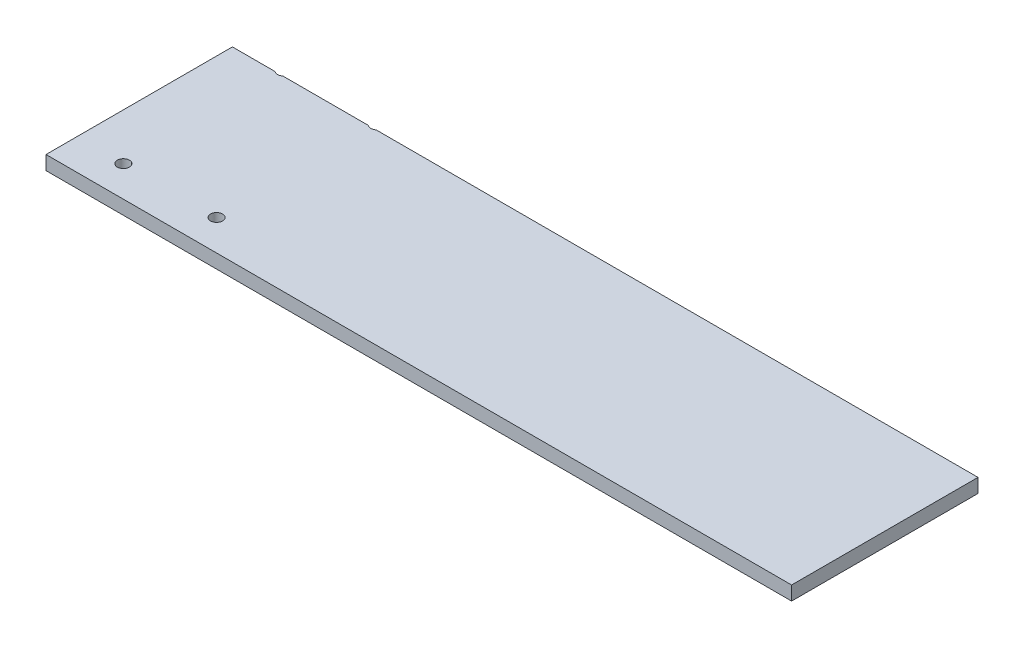
ISO-10303-21;
HEADER;
FILE_DESCRIPTION(('STEP AP214'),'2;1');
FILE_NAME('part.step','',(''),(''),'','','');
FILE_SCHEMA(('AUTOMOTIVE_DESIGN { 1 0 10303 214 1 1 1 1 }'));
ENDSEC;
DATA;
#1=APPLICATION_CONTEXT('core data for automotive mechanical design processes');
#2=APPLICATION_PROTOCOL_DEFINITION('international standard','automotive_design',2000,#1);
#3=PRODUCT_CONTEXT('',#1,'mechanical');
#4=PRODUCT('Part','Part','',(#3));
#5=PRODUCT_RELATED_PRODUCT_CATEGORY('part','',(#4));
#6=PRODUCT_DEFINITION_FORMATION('','',#4);
#7=PRODUCT_DEFINITION_CONTEXT('part definition',#1,'design');
#8=PRODUCT_DEFINITION('design','',#6,#7);
#9=PRODUCT_DEFINITION_SHAPE('','',#8);
#10=(LENGTH_UNIT() NAMED_UNIT(*) SI_UNIT(.MILLI.,.METRE.));
#11=(NAMED_UNIT(*) PLANE_ANGLE_UNIT() SI_UNIT($,.RADIAN.));
#12=(NAMED_UNIT(*) SI_UNIT($,.STERADIAN.) SOLID_ANGLE_UNIT());
#13=UNCERTAINTY_MEASURE_WITH_UNIT(LENGTH_MEASURE(1.E-05),#10,'distance_accuracy_value','');
#14=(GEOMETRIC_REPRESENTATION_CONTEXT(3) GLOBAL_UNCERTAINTY_ASSIGNED_CONTEXT((#13)) GLOBAL_UNIT_ASSIGNED_CONTEXT((#10,
#11,#12)) REPRESENTATION_CONTEXT('',''));
#15=CARTESIAN_POINT('',(0.,0.,0.));
#16=DIRECTION('',(0.,0.,1.));
#17=DIRECTION('',(1.,0.,0.));
#18=AXIS2_PLACEMENT_3D('',#15,#16,#17);
#19=CARTESIAN_POINT('',(-400.,7.5,-100.));
#20=DIRECTION('',(0.,0.,1.));
#21=DIRECTION('',(1.,0.,0.));
#22=AXIS2_PLACEMENT_3D('',#19,#20,#21);
#23=PLANE('',#22);
#24=DIRECTION('',(-1.,0.,0.));
#25=VECTOR('',#24,1.);
#26=CARTESIAN_POINT('',(-400.,-7.5,-100.));
#27=LINE('',#26,#25);
#28=CARTESIAN_POINT('',(-254.153311931459,-7.5,-100.));
#29=VERTEX_POINT('',#28);
#30=CARTESIAN_POINT('',(-345.846688068541,-7.5,-100.));
#31=VERTEX_POINT('',#30);
#32=EDGE_CURVE('E105',#29,#31,#27,.T.);
#33=ORIENTED_EDGE('',*,*,#32,.T.);
#34=DIRECTION('',(0.,1.,0.));
#35=VECTOR('',#34,1.);
#36=CARTESIAN_POINT('',(-345.846688068541,-7.5,-100.));
#37=LINE('',#36,#35);
#38=CARTESIAN_POINT('',(-345.846688068541,7.5,-100.));
#39=VERTEX_POINT('',#38);
#40=EDGE_CURVE('E47',#31,#39,#37,.T.);
#41=ORIENTED_EDGE('',*,*,#40,.T.);
#42=DIRECTION('',(-1.,0.,0.));
#43=VECTOR('',#42,1.);
#44=CARTESIAN_POINT('',(-400.,7.5,-100.));
#45=LINE('',#44,#43);
#46=CARTESIAN_POINT('',(-254.153311931459,7.5,-100.));
#47=VERTEX_POINT('',#46);
#48=EDGE_CURVE('E107',#47,#39,#45,.T.);
#49=ORIENTED_EDGE('',*,*,#48,.F.);
#50=DIRECTION('',(0.,1.,0.));
#51=VECTOR('',#50,1.);
#52=CARTESIAN_POINT('',(-254.153311931459,-7.5,-100.));
#53=LINE('',#52,#51);
#54=EDGE_CURVE('E96',#47,#29,#53,.F.);
#55=ORIENTED_EDGE('',*,*,#54,.T.);
#56=EDGE_LOOP('',(#33,#41,#49,#55));
#57=FACE_BOUND('',#56,.T.);
#58=ADVANCED_FACE('F33',(#57),#23,.F.);
#59=CARTESIAN_POINT('',(400.,-7.5,-100.));
#60=VERTEX_POINT('',#59);
#61=CARTESIAN_POINT('',(-245.846688068541,-7.5,-100.));
#62=VERTEX_POINT('',#61);
#63=EDGE_CURVE('E113',#60,#62,#27,.T.);
#64=ORIENTED_EDGE('',*,*,#63,.T.);
#65=DIRECTION('',(0.,1.,0.));
#66=VECTOR('',#65,1.);
#67=CARTESIAN_POINT('',(-245.846688068541,-7.5,-100.));
#68=LINE('',#67,#66);
#69=CARTESIAN_POINT('',(-245.846688068541,7.5,-100.));
#70=VERTEX_POINT('',#69);
#71=EDGE_CURVE('E55',#62,#70,#68,.T.);
#72=ORIENTED_EDGE('',*,*,#71,.T.);
#73=CARTESIAN_POINT('',(400.,7.5,-100.));
#74=VERTEX_POINT('',#73);
#75=EDGE_CURVE('E141',#74,#70,#45,.T.);
#76=ORIENTED_EDGE('',*,*,#75,.F.);
#77=DIRECTION('',(0.,-1.,0.));
#78=VECTOR('',#77,1.);
#79=CARTESIAN_POINT('',(400.,7.5,-100.));
#80=LINE('',#79,#78);
#81=EDGE_CURVE('E101',#74,#60,#80,.T.);
#82=ORIENTED_EDGE('',*,*,#81,.T.);
#83=EDGE_LOOP('',(#64,#72,#76,#82));
#84=FACE_BOUND('',#83,.T.);
#85=ADVANCED_FACE('F139',(#84),#23,.F.);
#86=CARTESIAN_POINT('',(400.,7.5,100.));
#87=DIRECTION('',(-1.,0.,0.));
#88=DIRECTION('',(0.,0.,1.));
#89=AXIS2_PLACEMENT_3D('',#86,#87,#88);
#90=PLANE('',#89);
#91=DIRECTION('',(0.,0.,-1.));
#92=VECTOR('',#91,1.);
#93=CARTESIAN_POINT('',(400.,-7.5,100.));
#94=LINE('',#93,#92);
#95=CARTESIAN_POINT('',(400.,-7.5,100.));
#96=VERTEX_POINT('',#95);
#97=EDGE_CURVE('E117',#96,#60,#94,.T.);
#98=ORIENTED_EDGE('',*,*,#97,.T.);
#99=ORIENTED_EDGE('',*,*,#81,.F.);
#100=DIRECTION('',(0.,0.,-1.));
#101=VECTOR('',#100,1.);
#102=CARTESIAN_POINT('',(400.,7.5,100.));
#103=LINE('',#102,#101);
#104=CARTESIAN_POINT('',(400.,7.5,100.));
#105=VERTEX_POINT('',#104);
#106=EDGE_CURVE('E124',#105,#74,#103,.T.);
#107=ORIENTED_EDGE('',*,*,#106,.F.);
#108=DIRECTION('',(0.,-1.,0.));
#109=VECTOR('',#108,1.);
#110=CARTESIAN_POINT('',(400.,7.5,100.));
#111=LINE('',#110,#109);
#112=EDGE_CURVE('E125',#105,#96,#111,.T.);
#113=ORIENTED_EDGE('',*,*,#112,.T.);
#114=EDGE_LOOP('',(#98,#99,#107,#113));
#115=FACE_BOUND('',#114,.T.);
#116=ADVANCED_FACE('F35',(#115),#90,.F.);
#117=CARTESIAN_POINT('',(-354.153311931459,7.5,-100.));
#118=VERTEX_POINT('',#117);
#119=CARTESIAN_POINT('',(-400.,7.5,-100.));
#120=VERTEX_POINT('',#119);
#121=EDGE_CURVE('E155',#118,#120,#45,.T.);
#122=ORIENTED_EDGE('',*,*,#121,.F.);
#123=DIRECTION('',(0.,1.,0.));
#124=VECTOR('',#123,1.);
#125=CARTESIAN_POINT('',(-354.153311931459,-7.5,-100.));
#126=LINE('',#125,#124);
#127=CARTESIAN_POINT('',(-354.153311931459,-7.5,-100.));
#128=VERTEX_POINT('',#127);
#129=EDGE_CURVE('E148',#118,#128,#126,.F.);
#130=ORIENTED_EDGE('',*,*,#129,.T.);
#131=CARTESIAN_POINT('',(-400.,-7.5,-100.));
#132=VERTEX_POINT('',#131);
#133=EDGE_CURVE('E114',#128,#132,#27,.T.);
#134=ORIENTED_EDGE('',*,*,#133,.T.);
#135=DIRECTION('',(0.,-1.,0.));
#136=VECTOR('',#135,1.);
#137=CARTESIAN_POINT('',(-400.,7.5,-100.));
#138=LINE('',#137,#136);
#139=EDGE_CURVE('E132',#120,#132,#138,.T.);
#140=ORIENTED_EDGE('',*,*,#139,.F.);
#141=EDGE_LOOP('',(#122,#130,#134,#140));
#142=FACE_BOUND('',#141,.T.);
#143=ADVANCED_FACE('F171',(#142),#23,.F.);
#144=CARTESIAN_POINT('',(-400.,7.5,100.));
#145=DIRECTION('',(1.,0.,0.));
#146=DIRECTION('',(0.,0.,-1.));
#147=AXIS2_PLACEMENT_3D('',#144,#145,#146);
#148=PLANE('',#147);
#149=DIRECTION('',(0.,0.,1.));
#150=VECTOR('',#149,1.);
#151=CARTESIAN_POINT('',(-400.,-7.5,100.));
#152=LINE('',#151,#150);
#153=CARTESIAN_POINT('',(-400.,-7.5,100.));
#154=VERTEX_POINT('',#153);
#155=EDGE_CURVE('E116',#132,#154,#152,.T.);
#156=ORIENTED_EDGE('',*,*,#155,.T.);
#157=DIRECTION('',(0.,-1.,0.));
#158=VECTOR('',#157,1.);
#159=CARTESIAN_POINT('',(-400.,7.5,100.));
#160=LINE('',#159,#158);
#161=CARTESIAN_POINT('',(-400.,7.5,100.));
#162=VERTEX_POINT('',#161);
#163=EDGE_CURVE('E128',#162,#154,#160,.T.);
#164=ORIENTED_EDGE('',*,*,#163,.F.);
#165=DIRECTION('',(0.,0.,1.));
#166=VECTOR('',#165,1.);
#167=CARTESIAN_POINT('',(-400.,7.5,100.));
#168=LINE('',#167,#166);
#169=EDGE_CURVE('E157',#120,#162,#168,.T.);
#170=ORIENTED_EDGE('',*,*,#169,.F.);
#171=ORIENTED_EDGE('',*,*,#139,.T.);
#172=EDGE_LOOP('',(#156,#164,#170,#171));
#173=FACE_BOUND('',#172,.T.);
#174=ADVANCED_FACE('F167',(#173),#148,.F.);
#175=CARTESIAN_POINT('',(-400.,7.5,100.));
#176=DIRECTION('',(0.,0.,-1.));
#177=DIRECTION('',(-1.,0.,0.));
#178=AXIS2_PLACEMENT_3D('',#175,#176,#177);
#179=PLANE('',#178);
#180=DIRECTION('',(1.,0.,0.));
#181=VECTOR('',#180,1.);
#182=CARTESIAN_POINT('',(-400.,-7.5,100.));
#183=LINE('',#182,#181);
#184=EDGE_CURVE('E122',#154,#96,#183,.T.);
#185=ORIENTED_EDGE('',*,*,#184,.T.);
#186=ORIENTED_EDGE('',*,*,#112,.F.);
#187=DIRECTION('',(1.,0.,0.));
#188=VECTOR('',#187,1.);
#189=CARTESIAN_POINT('',(-400.,7.5,100.));
#190=LINE('',#189,#188);
#191=EDGE_CURVE('E129',#162,#105,#190,.T.);
#192=ORIENTED_EDGE('',*,*,#191,.F.);
#193=ORIENTED_EDGE('',*,*,#163,.T.);
#194=EDGE_LOOP('',(#185,#186,#192,#193));
#195=FACE_BOUND('',#194,.T.);
#196=ADVANCED_FACE('F164',(#195),#179,.F.);
#197=CARTESIAN_POINT('',(0.,7.5,0.));
#198=DIRECTION('',(0.,-1.,0.));
#199=DIRECTION('',(0.,0.,-1.));
#200=AXIS2_PLACEMENT_3D('',#197,#198,#199);
#201=PLANE('',#200);
#202=CARTESIAN_POINT('',(-250.,7.5,66.9999999999999));
#203=DIRECTION('',(0.,1.,0.));
#204=DIRECTION('',(0.,0.,1.));
#205=AXIS2_PLACEMENT_3D('',#202,#203,#204);
#206=CIRCLE('',#205,6.50000000000002);
#207=CARTESIAN_POINT('',(-250.,7.5,73.4999999999999));
#208=VERTEX_POINT('',#207);
#209=EDGE_CURVE('E175',#208,#208,#206,.T.);
#210=ORIENTED_EDGE('',*,*,#209,.F.);
#211=EDGE_LOOP('',(#210));
#212=FACE_BOUND('',#211,.T.);
#213=CARTESIAN_POINT('',(-350.,7.5,66.9999999999999));
#214=DIRECTION('',(0.,1.,0.));
#215=DIRECTION('',(0.,0.,1.));
#216=AXIS2_PLACEMENT_3D('',#213,#214,#215);
#217=CIRCLE('',#216,6.50000000000007);
#218=CARTESIAN_POINT('',(-350.,7.5,73.5));
#219=VERTEX_POINT('',#218);
#220=EDGE_CURVE('E186',#219,#219,#217,.T.);
#221=ORIENTED_EDGE('',*,*,#220,.F.);
#222=EDGE_LOOP('',(#221));
#223=FACE_BOUND('',#222,.T.);
#224=ORIENTED_EDGE('',*,*,#48,.T.);
#225=CARTESIAN_POINT('',(-350.,7.5,-105.));
#226=DIRECTION('',(0.,1.,0.));
#227=DIRECTION('',(0.,0.,1.));
#228=AXIS2_PLACEMENT_3D('',#225,#226,#227);
#229=CIRCLE('',#228,6.49999999999996);
#230=EDGE_CURVE('E174',#118,#39,#229,.T.);
#231=ORIENTED_EDGE('',*,*,#230,.F.);
#232=ORIENTED_EDGE('',*,*,#121,.T.);
#233=ORIENTED_EDGE('',*,*,#169,.T.);
#234=ORIENTED_EDGE('',*,*,#191,.T.);
#235=ORIENTED_EDGE('',*,*,#106,.T.);
#236=ORIENTED_EDGE('',*,*,#75,.T.);
#237=CARTESIAN_POINT('',(-250.,7.5,-105.));
#238=DIRECTION('',(0.,1.,0.));
#239=DIRECTION('',(0.,0.,1.));
#240=AXIS2_PLACEMENT_3D('',#237,#238,#239);
#241=CIRCLE('',#240,6.50000000000002);
#242=EDGE_CURVE('E176',#47,#70,#241,.T.);
#243=ORIENTED_EDGE('',*,*,#242,.F.);
#244=EDGE_LOOP('',(#224,#231,#232,#233,#234,#235,#236,#243));
#245=FACE_BOUND('',#244,.T.);
#246=ADVANCED_FACE('F160',(#212,#223,#245),#201,.F.);
#247=CARTESIAN_POINT('',(0.,-7.5,0.));
#248=DIRECTION('',(0.,-1.,0.));
#249=DIRECTION('',(0.,0.,-1.));
#250=AXIS2_PLACEMENT_3D('',#247,#248,#249);
#251=PLANE('',#250);
#252=CARTESIAN_POINT('',(-250.,-7.5,66.9999999999999));
#253=DIRECTION('',(0.,1.,0.));
#254=DIRECTION('',(0.,0.,1.));
#255=AXIS2_PLACEMENT_3D('',#252,#253,#254);
#256=CIRCLE('',#255,6.50000000000002);
#257=CARTESIAN_POINT('',(-250.,-7.5,73.4999999999999));
#258=VERTEX_POINT('',#257);
#259=EDGE_CURVE('E179',#258,#258,#256,.T.);
#260=ORIENTED_EDGE('',*,*,#259,.T.);
#261=EDGE_LOOP('',(#260));
#262=FACE_BOUND('',#261,.T.);
#263=CARTESIAN_POINT('',(-350.,-7.5,-105.));
#264=DIRECTION('',(0.,-1.,0.));
#265=DIRECTION('',(0.,0.,-1.));
#266=AXIS2_PLACEMENT_3D('',#263,#264,#265);
#267=CIRCLE('',#266,6.49999999999996);
#268=EDGE_CURVE('E11',#31,#128,#267,.T.);
#269=ORIENTED_EDGE('',*,*,#268,.F.);
#270=ORIENTED_EDGE('',*,*,#32,.F.);
#271=CARTESIAN_POINT('',(-250.,-7.5,-105.));
#272=DIRECTION('',(0.,-1.,0.));
#273=DIRECTION('',(0.,0.,-1.));
#274=AXIS2_PLACEMENT_3D('',#271,#272,#273);
#275=CIRCLE('',#274,6.50000000000002);
#276=EDGE_CURVE('E41',#62,#29,#275,.T.);
#277=ORIENTED_EDGE('',*,*,#276,.F.);
#278=ORIENTED_EDGE('',*,*,#63,.F.);
#279=ORIENTED_EDGE('',*,*,#97,.F.);
#280=ORIENTED_EDGE('',*,*,#184,.F.);
#281=ORIENTED_EDGE('',*,*,#155,.F.);
#282=ORIENTED_EDGE('',*,*,#133,.F.);
#283=EDGE_LOOP('',(#269,#270,#277,#278,#279,#280,#281,#282));
#284=FACE_BOUND('',#283,.T.);
#285=CARTESIAN_POINT('',(-350.,-7.5,66.9999999999999));
#286=DIRECTION('',(0.,1.,0.));
#287=DIRECTION('',(0.,0.,1.));
#288=AXIS2_PLACEMENT_3D('',#285,#286,#287);
#289=CIRCLE('',#288,6.50000000000007);
#290=CARTESIAN_POINT('',(-350.,-7.5,73.5));
#291=VERTEX_POINT('',#290);
#292=EDGE_CURVE('E108',#291,#291,#289,.T.);
#293=ORIENTED_EDGE('',*,*,#292,.T.);
#294=EDGE_LOOP('',(#293));
#295=FACE_BOUND('',#294,.T.);
#296=ADVANCED_FACE('F110',(#262,#284,#295),#251,.T.);
#297=CARTESIAN_POINT('',(-350.,-7.5,66.9999999999999));
#298=DIRECTION('',(0.,1.,0.));
#299=DIRECTION('',(0.,0.,1.));
#300=AXIS2_PLACEMENT_3D('',#297,#298,#299);
#301=CYLINDRICAL_SURFACE('',#300,6.50000000000007);
#302=ORIENTED_EDGE('',*,*,#292,.F.);
#303=EDGE_LOOP('',(#302));
#304=FACE_BOUND('',#303,.T.);
#305=ORIENTED_EDGE('',*,*,#220,.T.);
#306=EDGE_LOOP('',(#305));
#307=FACE_BOUND('',#306,.T.);
#308=ADVANCED_FACE('F207',(#304,#307),#301,.F.);
#309=CARTESIAN_POINT('',(-250.,-7.5,-105.));
#310=DIRECTION('',(0.,1.,0.));
#311=DIRECTION('',(0.,0.,1.));
#312=AXIS2_PLACEMENT_3D('',#309,#310,#311);
#313=CYLINDRICAL_SURFACE('',#312,6.50000000000002);
#314=ORIENTED_EDGE('',*,*,#276,.T.);
#315=ORIENTED_EDGE('',*,*,#54,.F.);
#316=ORIENTED_EDGE('',*,*,#242,.T.);
#317=ORIENTED_EDGE('',*,*,#71,.F.);
#318=EDGE_LOOP('',(#314,#315,#316,#317));
#319=FACE_BOUND('',#318,.T.);
#320=ADVANCED_FACE('F95',(#319),#313,.F.);
#321=CARTESIAN_POINT('',(-350.,-7.5,-105.));
#322=DIRECTION('',(0.,1.,0.));
#323=DIRECTION('',(0.,0.,1.));
#324=AXIS2_PLACEMENT_3D('',#321,#322,#323);
#325=CYLINDRICAL_SURFACE('',#324,6.49999999999996);
#326=ORIENTED_EDGE('',*,*,#268,.T.);
#327=ORIENTED_EDGE('',*,*,#129,.F.);
#328=ORIENTED_EDGE('',*,*,#230,.T.);
#329=ORIENTED_EDGE('',*,*,#40,.F.);
#330=EDGE_LOOP('',(#326,#327,#328,#329));
#331=FACE_BOUND('',#330,.T.);
#332=ADVANCED_FACE('F173',(#331),#325,.F.);
#333=CARTESIAN_POINT('',(-250.,-7.5,66.9999999999999));
#334=DIRECTION('',(0.,1.,0.));
#335=DIRECTION('',(0.,0.,1.));
#336=AXIS2_PLACEMENT_3D('',#333,#334,#335);
#337=CYLINDRICAL_SURFACE('',#336,6.50000000000002);
#338=ORIENTED_EDGE('',*,*,#259,.F.);
#339=EDGE_LOOP('',(#338));
#340=FACE_BOUND('',#339,.T.);
#341=ORIENTED_EDGE('',*,*,#209,.T.);
#342=EDGE_LOOP('',(#341));
#343=FACE_BOUND('',#342,.T.);
#344=ADVANCED_FACE('F194',(#340,#343),#337,.F.);
#345=CLOSED_SHELL('',(#58,#85,#116,#143,#174,#196,#246,#296,#308,#320,#332,#344));
#346=MANIFOLD_SOLID_BREP('B2',#345);
#347=ADVANCED_BREP_SHAPE_REPRESENTATION('',(#18,#346),#14);
#348=SHAPE_DEFINITION_REPRESENTATION(#9,#347);
ENDSEC;
END-ISO-10303-21;
